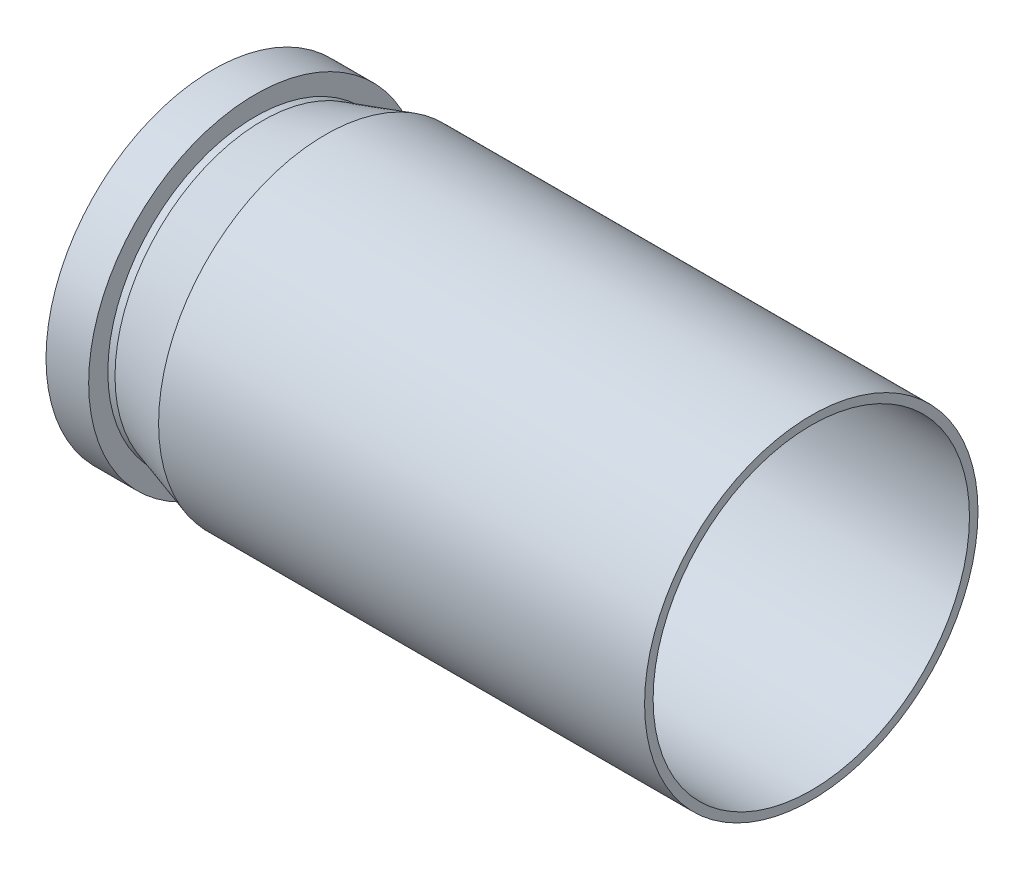
ISO-10303-21;
HEADER;
FILE_DESCRIPTION(('STEP AP214'),'2;1');
FILE_NAME('part.step','',(''),(''),'','','');
FILE_SCHEMA(('AUTOMOTIVE_DESIGN { 1 0 10303 214 1 1 1 1 }'));
ENDSEC;
DATA;
#1=APPLICATION_CONTEXT('core data for automotive mechanical design processes');
#2=APPLICATION_PROTOCOL_DEFINITION('international standard','automotive_design',2000,#1);
#3=PRODUCT_CONTEXT('',#1,'mechanical');
#4=PRODUCT('Part','Part','',(#3));
#5=PRODUCT_RELATED_PRODUCT_CATEGORY('part','',(#4));
#6=PRODUCT_DEFINITION_FORMATION('','',#4);
#7=PRODUCT_DEFINITION_CONTEXT('part definition',#1,'design');
#8=PRODUCT_DEFINITION('design','',#6,#7);
#9=PRODUCT_DEFINITION_SHAPE('','',#8);
#10=(LENGTH_UNIT() NAMED_UNIT(*) SI_UNIT(.MILLI.,.METRE.));
#11=(NAMED_UNIT(*) PLANE_ANGLE_UNIT() SI_UNIT($,.RADIAN.));
#12=(NAMED_UNIT(*) SI_UNIT($,.STERADIAN.) SOLID_ANGLE_UNIT());
#13=UNCERTAINTY_MEASURE_WITH_UNIT(LENGTH_MEASURE(1.E-05),#10,'distance_accuracy_value','');
#14=(GEOMETRIC_REPRESENTATION_CONTEXT(3) GLOBAL_UNCERTAINTY_ASSIGNED_CONTEXT((#13)) GLOBAL_UNIT_ASSIGNED_CONTEXT((#10,
#11,#12)) REPRESENTATION_CONTEXT('',''));
#15=CARTESIAN_POINT('',(0.,0.,0.));
#16=DIRECTION('',(0.,0.,1.));
#17=DIRECTION('',(1.,0.,0.));
#18=AXIS2_PLACEMENT_3D('',#15,#16,#17);
#19=CARTESIAN_POINT('',(0.,0.,0.));
#20=DIRECTION('',(-1.,0.,0.));
#21=DIRECTION('',(0.,0.,1.));
#22=AXIS2_PLACEMENT_3D('',#19,#20,#21);
#23=CYLINDRICAL_SURFACE('',#22,1.);
#24=CARTESIAN_POINT('',(4.16,0.,0.));
#25=DIRECTION('',(-1.,0.,0.));
#26=DIRECTION('',(0.,0.,1.));
#27=AXIS2_PLACEMENT_3D('',#24,#25,#26);
#28=CIRCLE('',#27,1.);
#29=CARTESIAN_POINT('',(4.16,0.,1.));
#30=VERTEX_POINT('',#29);
#31=EDGE_CURVE('E60',#30,#30,#28,.T.);
#32=ORIENTED_EDGE('',*,*,#31,.F.);
#33=EDGE_LOOP('',(#32));
#34=FACE_BOUND('',#33,.T.);
#35=CARTESIAN_POINT('',(3.,0.,0.));
#36=DIRECTION('',(-1.,0.,0.));
#37=DIRECTION('',(0.,0.,1.));
#38=AXIS2_PLACEMENT_3D('',#35,#36,#37);
#39=CIRCLE('',#38,1.);
#40=CARTESIAN_POINT('',(3.,0.,1.));
#41=VERTEX_POINT('',#40);
#42=EDGE_CURVE('E90',#41,#41,#39,.T.);
#43=ORIENTED_EDGE('',*,*,#42,.T.);
#44=EDGE_LOOP('',(#43));
#45=FACE_BOUND('',#44,.T.);
#46=ADVANCED_FACE('F49',(#34,#45),#23,.F.);
#47=CARTESIAN_POINT('',(4.16,1.,0.));
#48=DIRECTION('',(-1.,0.,0.));
#49=DIRECTION('',(0.,0.,1.));
#50=AXIS2_PLACEMENT_3D('',#47,#48,#49);
#51=PLANE('',#50);
#52=CARTESIAN_POINT('',(4.16,0.,0.));
#53=DIRECTION('',(-1.,0.,0.));
#54=DIRECTION('',(0.,0.,1.));
#55=AXIS2_PLACEMENT_3D('',#52,#53,#54);
#56=CIRCLE('',#55,4.45);
#57=CARTESIAN_POINT('',(4.16,0.,4.45));
#58=VERTEX_POINT('',#57);
#59=EDGE_CURVE('E64',#58,#58,#56,.T.);
#60=ORIENTED_EDGE('',*,*,#59,.F.);
#61=EDGE_LOOP('',(#60));
#62=FACE_BOUND('',#61,.T.);
#63=ORIENTED_EDGE('',*,*,#31,.T.);
#64=EDGE_LOOP('',(#63));
#65=FACE_BOUND('',#64,.T.);
#66=ADVANCED_FACE('F135',(#62,#65),#51,.F.);
#67=CARTESIAN_POINT('',(0.,0.,0.));
#68=DIRECTION('',(-1.,0.,0.));
#69=DIRECTION('',(0.,0.,1.));
#70=AXIS2_PLACEMENT_3D('',#67,#68,#69);
#71=CYLINDRICAL_SURFACE('',#70,4.45);
#72=CARTESIAN_POINT('',(16.84,0.,0.));
#73=DIRECTION('',(-1.,0.,0.));
#74=DIRECTION('',(0.,0.,1.));
#75=AXIS2_PLACEMENT_3D('',#72,#73,#74);
#76=CIRCLE('',#75,4.45);
#77=CARTESIAN_POINT('',(16.84,0.,4.45));
#78=VERTEX_POINT('',#77);
#79=EDGE_CURVE('E69',#78,#78,#76,.T.);
#80=ORIENTED_EDGE('',*,*,#79,.F.);
#81=EDGE_LOOP('',(#80));
#82=FACE_BOUND('',#81,.T.);
#83=ORIENTED_EDGE('',*,*,#59,.T.);
#84=EDGE_LOOP('',(#83));
#85=FACE_BOUND('',#84,.T.);
#86=ADVANCED_FACE('F140',(#82,#85),#71,.F.);
#87=CARTESIAN_POINT('',(16.84,4.45,0.));
#88=DIRECTION('',(-1.,0.,0.));
#89=DIRECTION('',(0.,0.,1.));
#90=AXIS2_PLACEMENT_3D('',#87,#88,#89);
#91=PLANE('',#90);
#92=CARTESIAN_POINT('',(16.84,0.,0.));
#93=DIRECTION('',(-1.,0.,0.));
#94=DIRECTION('',(0.,0.,1.));
#95=AXIS2_PLACEMENT_3D('',#92,#93,#94);
#96=CIRCLE('',#95,4.69);
#97=CARTESIAN_POINT('',(16.84,0.,4.69));
#98=VERTEX_POINT('',#97);
#99=EDGE_CURVE('E72',#98,#98,#96,.T.);
#100=ORIENTED_EDGE('',*,*,#99,.F.);
#101=EDGE_LOOP('',(#100));
#102=FACE_BOUND('',#101,.T.);
#103=ORIENTED_EDGE('',*,*,#79,.T.);
#104=EDGE_LOOP('',(#103));
#105=FACE_BOUND('',#104,.T.);
#106=ADVANCED_FACE('F132',(#102,#105),#91,.F.);
#107=CARTESIAN_POINT('',(0.,0.,0.));
#108=DIRECTION('',(-1.,0.,0.));
#109=DIRECTION('',(0.,0.,1.));
#110=AXIS2_PLACEMENT_3D('',#107,#108,#109);
#111=CYLINDRICAL_SURFACE('',#110,4.69);
#112=CARTESIAN_POINT('',(3.16729147381512,0.,0.));
#113=DIRECTION('',(1.,0.,0.));
#114=DIRECTION('',(0.,0.,-1.));
#115=AXIS2_PLACEMENT_3D('',#112,#113,#114);
#116=CIRCLE('',#115,4.69);
#117=CARTESIAN_POINT('',(3.16729147381512,0.,-4.69));
#118=VERTEX_POINT('',#117);
#119=EDGE_CURVE('E12',#118,#118,#116,.T.);
#120=ORIENTED_EDGE('',*,*,#119,.T.);
#121=EDGE_LOOP('',(#120));
#122=FACE_BOUND('',#121,.T.);
#123=ORIENTED_EDGE('',*,*,#99,.T.);
#124=EDGE_LOOP('',(#123));
#125=FACE_BOUND('',#124,.T.);
#126=ADVANCED_FACE('F127',(#122,#125),#111,.T.);
#127=CARTESIAN_POINT('',(0.,0.,0.));
#128=DIRECTION('',(-1.,0.,0.));
#129=DIRECTION('',(0.,0.,1.));
#130=AXIS2_PLACEMENT_3D('',#127,#128,#129);
#131=CYLINDRICAL_SURFACE('',#130,4.15);
#132=CARTESIAN_POINT('',(1.40103105983366,0.,0.));
#133=DIRECTION('',(1.,0.,0.));
#134=DIRECTION('',(0.,0.,-1.));
#135=AXIS2_PLACEMENT_3D('',#132,#133,#134);
#136=CIRCLE('',#135,4.15);
#137=CARTESIAN_POINT('',(1.40103105983366,0.,-4.15));
#138=VERTEX_POINT('',#137);
#139=EDGE_CURVE('E56',#138,#138,#136,.F.);
#140=ORIENTED_EDGE('',*,*,#139,.T.);
#141=EDGE_LOOP('',(#140));
#142=FACE_BOUND('',#141,.T.);
#143=CARTESIAN_POINT('',(1.2,0.,0.));
#144=DIRECTION('',(-1.,0.,0.));
#145=DIRECTION('',(0.,0.,1.));
#146=AXIS2_PLACEMENT_3D('',#143,#144,#145);
#147=CIRCLE('',#146,4.15);
#148=CARTESIAN_POINT('',(1.2,0.,4.15));
#149=VERTEX_POINT('',#148);
#150=EDGE_CURVE('E75',#149,#149,#147,.T.);
#151=ORIENTED_EDGE('',*,*,#150,.F.);
#152=EDGE_LOOP('',(#151));
#153=FACE_BOUND('',#152,.T.);
#154=ADVANCED_FACE('F122',(#142,#153),#131,.T.);
#155=CARTESIAN_POINT('',(1.2,4.15,0.));
#156=DIRECTION('',(-1.,0.,0.));
#157=DIRECTION('',(0.,0.,1.));
#158=AXIS2_PLACEMENT_3D('',#155,#156,#157);
#159=PLANE('',#158);
#160=CARTESIAN_POINT('',(1.2,0.,0.));
#161=DIRECTION('',(-1.,0.,0.));
#162=DIRECTION('',(0.,0.,1.));
#163=AXIS2_PLACEMENT_3D('',#160,#161,#162);
#164=CIRCLE('',#163,4.69);
#165=CARTESIAN_POINT('',(1.2,0.,4.69));
#166=VERTEX_POINT('',#165);
#167=EDGE_CURVE('E78',#166,#166,#164,.T.);
#168=ORIENTED_EDGE('',*,*,#167,.F.);
#169=EDGE_LOOP('',(#168));
#170=FACE_BOUND('',#169,.T.);
#171=ORIENTED_EDGE('',*,*,#150,.T.);
#172=EDGE_LOOP('',(#171));
#173=FACE_BOUND('',#172,.T.);
#174=ADVANCED_FACE('F116',(#170,#173),#159,.F.);
#175=CARTESIAN_POINT('',(0.,0.,0.));
#176=DIRECTION('',(-1.,0.,0.));
#177=DIRECTION('',(0.,0.,1.));
#178=AXIS2_PLACEMENT_3D('',#175,#176,#177);
#179=CYLINDRICAL_SURFACE('',#178,4.69);
#180=CARTESIAN_POINT('',(0.,0.,0.));
#181=DIRECTION('',(-1.,0.,0.));
#182=DIRECTION('',(0.,0.,1.));
#183=AXIS2_PLACEMENT_3D('',#180,#181,#182);
#184=CIRCLE('',#183,4.69);
#185=CARTESIAN_POINT('',(0.,0.,4.69));
#186=VERTEX_POINT('',#185);
#187=EDGE_CURVE('E81',#186,#186,#184,.T.);
#188=ORIENTED_EDGE('',*,*,#187,.F.);
#189=EDGE_LOOP('',(#188));
#190=FACE_BOUND('',#189,.T.);
#191=ORIENTED_EDGE('',*,*,#167,.T.);
#192=EDGE_LOOP('',(#191));
#193=FACE_BOUND('',#192,.T.);
#194=ADVANCED_FACE('F110',(#190,#193),#179,.T.);
#195=CARTESIAN_POINT('',(0.,4.69,0.));
#196=DIRECTION('',(1.,0.,0.));
#197=DIRECTION('',(0.,0.,-1.));
#198=AXIS2_PLACEMENT_3D('',#195,#196,#197);
#199=PLANE('',#198);
#200=CARTESIAN_POINT('',(0.,0.,0.));
#201=DIRECTION('',(-1.,0.,0.));
#202=DIRECTION('',(0.,0.,1.));
#203=AXIS2_PLACEMENT_3D('',#200,#201,#202);
#204=CIRCLE('',#203,2.25);
#205=CARTESIAN_POINT('',(0.,0.,2.25));
#206=VERTEX_POINT('',#205);
#207=EDGE_CURVE('E84',#206,#206,#204,.T.);
#208=ORIENTED_EDGE('',*,*,#207,.F.);
#209=EDGE_LOOP('',(#208));
#210=FACE_BOUND('',#209,.T.);
#211=ORIENTED_EDGE('',*,*,#187,.T.);
#212=EDGE_LOOP('',(#211));
#213=FACE_BOUND('',#212,.T.);
#214=ADVANCED_FACE('F104',(#210,#213),#199,.F.);
#215=CARTESIAN_POINT('',(0.,0.,0.));
#216=DIRECTION('',(-1.,0.,0.));
#217=DIRECTION('',(0.,0.,1.));
#218=AXIS2_PLACEMENT_3D('',#215,#216,#217);
#219=CYLINDRICAL_SURFACE('',#218,2.25);
#220=CARTESIAN_POINT('',(3.,0.,0.));
#221=DIRECTION('',(-1.,0.,0.));
#222=DIRECTION('',(0.,0.,1.));
#223=AXIS2_PLACEMENT_3D('',#220,#221,#222);
#224=CIRCLE('',#223,2.25);
#225=CARTESIAN_POINT('',(3.,0.,2.25));
#226=VERTEX_POINT('',#225);
#227=EDGE_CURVE('E87',#226,#226,#224,.T.);
#228=ORIENTED_EDGE('',*,*,#227,.F.);
#229=EDGE_LOOP('',(#228));
#230=FACE_BOUND('',#229,.T.);
#231=ORIENTED_EDGE('',*,*,#207,.T.);
#232=EDGE_LOOP('',(#231));
#233=FACE_BOUND('',#232,.T.);
#234=ADVANCED_FACE('F98',(#230,#233),#219,.F.);
#235=CARTESIAN_POINT('',(3.,2.25,0.));
#236=DIRECTION('',(1.,0.,0.));
#237=DIRECTION('',(0.,0.,-1.));
#238=AXIS2_PLACEMENT_3D('',#235,#236,#237);
#239=PLANE('',#238);
#240=ORIENTED_EDGE('',*,*,#42,.F.);
#241=EDGE_LOOP('',(#240));
#242=FACE_BOUND('',#241,.T.);
#243=ORIENTED_EDGE('',*,*,#227,.T.);
#244=EDGE_LOOP('',(#243));
#245=FACE_BOUND('',#244,.T.);
#246=ADVANCED_FACE('F95',(#242,#245),#239,.F.);
#247=CARTESIAN_POINT('',(1.40103105983366,0.,0.));
#248=DIRECTION('',(1.,0.,0.));
#249=DIRECTION('',(0.,0.,-1.));
#250=AXIS2_PLACEMENT_3D('',#247,#248,#249);
#251=CONICAL_SURFACE('',#250,4.15,0.296705972839032);
#252=ORIENTED_EDGE('',*,*,#119,.F.);
#253=EDGE_LOOP('',(#252));
#254=FACE_BOUND('',#253,.T.);
#255=ORIENTED_EDGE('',*,*,#139,.F.);
#256=EDGE_LOOP('',(#255));
#257=FACE_BOUND('',#256,.T.);
#258=ADVANCED_FACE('F51',(#254,#257),#251,.T.);
#259=CLOSED_SHELL('',(#46,#66,#86,#106,#126,#154,#174,#194,#214,#234,#246,#258));
#260=MANIFOLD_SOLID_BREP('B2',#259);
#261=ADVANCED_BREP_SHAPE_REPRESENTATION('',(#18,#260),#14);
#262=SHAPE_DEFINITION_REPRESENTATION(#9,#261);
ENDSEC;
END-ISO-10303-21;
